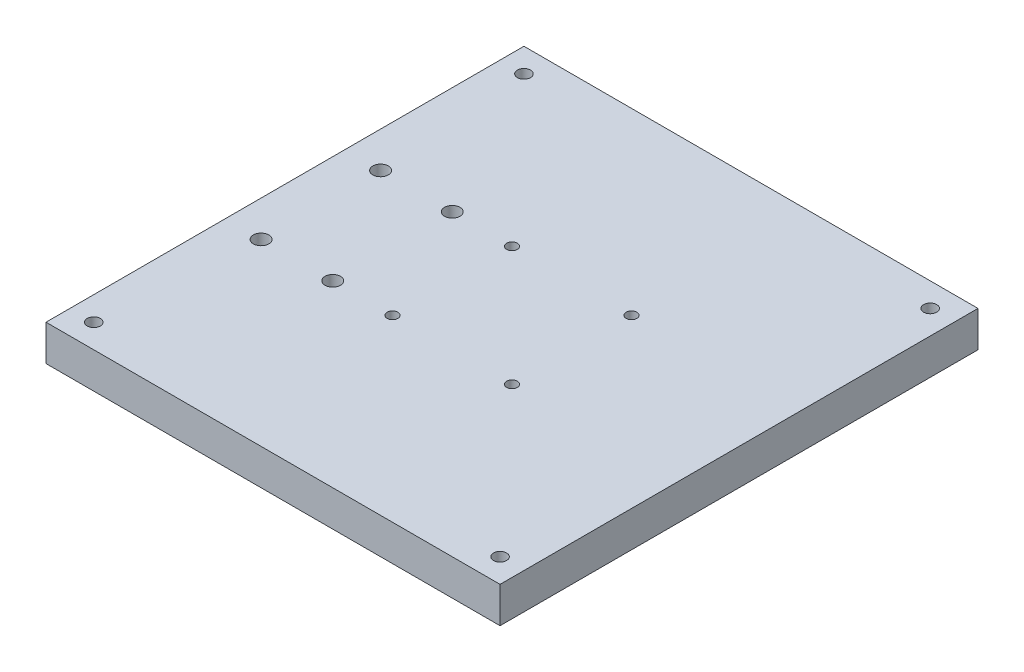
ISO-10303-21;
HEADER;
FILE_DESCRIPTION(('STEP AP214'),'2;1');
FILE_NAME('part.step','',(''),(''),'','','');
FILE_SCHEMA(('AUTOMOTIVE_DESIGN { 1 0 10303 214 1 1 1 1 }'));
ENDSEC;
DATA;
#1=APPLICATION_CONTEXT('core data for automotive mechanical design processes');
#2=APPLICATION_PROTOCOL_DEFINITION('international standard','automotive_design',2000,#1);
#3=PRODUCT_CONTEXT('',#1,'mechanical');
#4=PRODUCT('Part','Part','',(#3));
#5=PRODUCT_RELATED_PRODUCT_CATEGORY('part','',(#4));
#6=PRODUCT_DEFINITION_FORMATION('','',#4);
#7=PRODUCT_DEFINITION_CONTEXT('part definition',#1,'design');
#8=PRODUCT_DEFINITION('design','',#6,#7);
#9=PRODUCT_DEFINITION_SHAPE('','',#8);
#10=(LENGTH_UNIT() NAMED_UNIT(*) SI_UNIT(.MILLI.,.METRE.));
#11=(NAMED_UNIT(*) PLANE_ANGLE_UNIT() SI_UNIT($,.RADIAN.));
#12=(NAMED_UNIT(*) SI_UNIT($,.STERADIAN.) SOLID_ANGLE_UNIT());
#13=UNCERTAINTY_MEASURE_WITH_UNIT(LENGTH_MEASURE(1.E-05),#10,'distance_accuracy_value','');
#14=(GEOMETRIC_REPRESENTATION_CONTEXT(3) GLOBAL_UNCERTAINTY_ASSIGNED_CONTEXT((#13)) GLOBAL_UNIT_ASSIGNED_CONTEXT((#10,
#11,#12)) REPRESENTATION_CONTEXT('',''));
#15=CARTESIAN_POINT('',(0.,0.,0.));
#16=DIRECTION('',(0.,0.,1.));
#17=DIRECTION('',(1.,0.,0.));
#18=AXIS2_PLACEMENT_3D('',#15,#16,#17);
#19=CARTESIAN_POINT('',(0.,0.,0.));
#20=DIRECTION('',(0.,-1.,0.));
#21=DIRECTION('',(0.,0.,-1.));
#22=AXIS2_PLACEMENT_3D('',#19,#20,#21);
#23=PLANE('',#22);
#24=CARTESIAN_POINT('',(-99.2148760330578,0.,73.3471074380166));
#25=DIRECTION('',(0.,-1.,0.));
#26=DIRECTION('',(0.,0.,-1.));
#27=AXIS2_PLACEMENT_3D('',#24,#25,#26);
#28=CIRCLE('',#27,9.99999999999999);
#29=CARTESIAN_POINT('',(-99.2148760330578,0.,63.3471074380166));
#30=VERTEX_POINT('',#29);
#31=EDGE_CURVE('E542',#30,#30,#28,.T.);
#32=ORIENTED_EDGE('',*,*,#31,.F.);
#33=EDGE_LOOP('',(#32));
#34=FACE_BOUND('',#33,.T.);
#35=CARTESIAN_POINT('',(-159.214876033058,0.,73.3471074380166));
#36=DIRECTION('',(0.,-1.,0.));
#37=DIRECTION('',(0.,0.,-1.));
#38=AXIS2_PLACEMENT_3D('',#35,#36,#37);
#39=CIRCLE('',#38,9.99999999999998);
#40=CARTESIAN_POINT('',(-159.214876033058,0.,63.3471074380166));
#41=VERTEX_POINT('',#40);
#42=EDGE_CURVE('E179',#41,#41,#39,.T.);
#43=ORIENTED_EDGE('',*,*,#42,.F.);
#44=EDGE_LOOP('',(#43));
#45=FACE_BOUND('',#44,.T.);
#46=CARTESIAN_POINT('',(-159.214876033058,0.,-26.6528925619834));
#47=DIRECTION('',(0.,-1.,0.));
#48=DIRECTION('',(0.,0.,-1.));
#49=AXIS2_PLACEMENT_3D('',#46,#47,#48);
#50=CIRCLE('',#49,9.99999999999998);
#51=CARTESIAN_POINT('',(-159.214876033058,0.,-36.6528925619834));
#52=VERTEX_POINT('',#51);
#53=EDGE_CURVE('E175',#52,#52,#50,.T.);
#54=ORIENTED_EDGE('',*,*,#53,.F.);
#55=EDGE_LOOP('',(#54));
#56=FACE_BOUND('',#55,.T.);
#57=CARTESIAN_POINT('',(-99.2148760330578,0.,-26.6528925619834));
#58=DIRECTION('',(0.,-1.,0.));
#59=DIRECTION('',(0.,0.,-1.));
#60=AXIS2_PLACEMENT_3D('',#57,#58,#59);
#61=CIRCLE('',#60,9.99999999999999);
#62=CARTESIAN_POINT('',(-99.2148760330578,0.,-36.6528925619834));
#63=VERTEX_POINT('',#62);
#64=EDGE_CURVE('E167',#63,#63,#61,.T.);
#65=ORIENTED_EDGE('',*,*,#64,.F.);
#66=EDGE_LOOP('',(#65));
#67=FACE_BOUND('',#66,.T.);
#68=CARTESIAN_POINT('',(50.7851239669422,0.,-26.6528925619834));
#69=DIRECTION('',(0.,1.,0.));
#70=DIRECTION('',(0.,0.,1.));
#71=AXIS2_PLACEMENT_3D('',#68,#69,#70);
#72=CIRCLE('',#71,4.49999999999998);
#73=CARTESIAN_POINT('',(50.7851239669422,0.,-22.1528925619834));
#74=VERTEX_POINT('',#73);
#75=EDGE_CURVE('E210',#74,#74,#72,.T.);
#76=ORIENTED_EDGE('',*,*,#75,.T.);
#77=EDGE_LOOP('',(#76));
#78=FACE_BOUND('',#77,.T.);
#79=DIRECTION('',(0.,0.,-1.));
#80=VECTOR('',#79,1.);
#81=CARTESIAN_POINT('',(190.785123966942,0.,223.347107438017));
#82=LINE('',#81,#80);
#83=CARTESIAN_POINT('',(190.785123966942,0.,223.347107438017));
#84=VERTEX_POINT('',#83);
#85=CARTESIAN_POINT('',(190.785123966942,0.,-176.652892561983));
#86=VERTEX_POINT('',#85);
#87=EDGE_CURVE('E142',#84,#86,#82,.T.);
#88=ORIENTED_EDGE('',*,*,#87,.F.);
#89=DIRECTION('',(1.,0.,0.));
#90=VECTOR('',#89,1.);
#91=CARTESIAN_POINT('',(-189.214876033058,0.,223.347107438017));
#92=LINE('',#91,#90);
#93=CARTESIAN_POINT('',(-189.214876033058,0.,223.347107438017));
#94=VERTEX_POINT('',#93);
#95=EDGE_CURVE('E89',#94,#84,#92,.T.);
#96=ORIENTED_EDGE('',*,*,#95,.F.);
#97=DIRECTION('',(0.,0.,1.));
#98=VECTOR('',#97,1.);
#99=CARTESIAN_POINT('',(-189.214876033058,0.,223.347107438017));
#100=LINE('',#99,#98);
#101=CARTESIAN_POINT('',(-189.214876033058,0.,-176.652892561983));
#102=VERTEX_POINT('',#101);
#103=EDGE_CURVE('E85',#102,#94,#100,.T.);
#104=ORIENTED_EDGE('',*,*,#103,.F.);
#105=DIRECTION('',(-1.,0.,0.));
#106=VECTOR('',#105,1.);
#107=CARTESIAN_POINT('',(-189.214876033058,0.,-176.652892561983));
#108=LINE('',#107,#106);
#109=EDGE_CURVE('E153',#86,#102,#108,.T.);
#110=ORIENTED_EDGE('',*,*,#109,.F.);
#111=EDGE_LOOP('',(#88,#96,#104,#110));
#112=FACE_BOUND('',#111,.T.);
#113=CARTESIAN_POINT('',(155.785123966942,0.,188.347107438017));
#114=DIRECTION('',(0.,-1.,0.));
#115=DIRECTION('',(0.,0.,-1.));
#116=AXIS2_PLACEMENT_3D('',#113,#114,#115);
#117=CIRCLE('',#116,3.5);
#118=CARTESIAN_POINT('',(155.785123966942,0.,184.847107438017));
#119=VERTEX_POINT('',#118);
#120=EDGE_CURVE('E140',#119,#119,#117,.T.);
#121=ORIENTED_EDGE('',*,*,#120,.F.);
#122=EDGE_LOOP('',(#121));
#123=FACE_BOUND('',#122,.T.);
#124=CARTESIAN_POINT('',(-154.214876033058,0.,188.347107438017));
#125=DIRECTION('',(0.,-1.,0.));
#126=DIRECTION('',(0.,0.,-1.));
#127=AXIS2_PLACEMENT_3D('',#124,#125,#126);
#128=CIRCLE('',#127,3.5);
#129=CARTESIAN_POINT('',(-154.214876033058,0.,184.847107438017));
#130=VERTEX_POINT('',#129);
#131=EDGE_CURVE('E132',#130,#130,#128,.T.);
#132=ORIENTED_EDGE('',*,*,#131,.F.);
#133=EDGE_LOOP('',(#132));
#134=FACE_BOUND('',#133,.T.);
#135=CARTESIAN_POINT('',(155.785123966942,0.,-141.652892561983));
#136=DIRECTION('',(0.,-1.,0.));
#137=DIRECTION('',(0.,0.,-1.));
#138=AXIS2_PLACEMENT_3D('',#135,#136,#137);
#139=CIRCLE('',#138,3.5);
#140=CARTESIAN_POINT('',(155.785123966942,0.,-145.152892561983));
#141=VERTEX_POINT('',#140);
#142=EDGE_CURVE('E118',#141,#141,#139,.T.);
#143=ORIENTED_EDGE('',*,*,#142,.F.);
#144=EDGE_LOOP('',(#143));
#145=FACE_BOUND('',#144,.T.);
#146=CARTESIAN_POINT('',(-154.214876033058,0.,-141.652892561983));
#147=DIRECTION('',(0.,-1.,0.));
#148=DIRECTION('',(0.,0.,-1.));
#149=AXIS2_PLACEMENT_3D('',#146,#147,#148);
#150=CIRCLE('',#149,3.5);
#151=CARTESIAN_POINT('',(-154.214876033058,0.,-145.152892561983));
#152=VERTEX_POINT('',#151);
#153=EDGE_CURVE('E117',#152,#152,#150,.T.);
#154=ORIENTED_EDGE('',*,*,#153,.F.);
#155=EDGE_LOOP('',(#154));
#156=FACE_BOUND('',#155,.T.);
#157=CARTESIAN_POINT('',(170.785123966942,0.,203.347107438017));
#158=DIRECTION('',(0.,-1.,0.));
#159=DIRECTION('',(0.,0.,-1.));
#160=AXIS2_PLACEMENT_3D('',#157,#158,#159);
#161=CIRCLE('',#160,5.50000000000001);
#162=CARTESIAN_POINT('',(170.785123966942,0.,197.847107438017));
#163=VERTEX_POINT('',#162);
#164=EDGE_CURVE('E248',#163,#163,#161,.T.);
#165=ORIENTED_EDGE('',*,*,#164,.F.);
#166=EDGE_LOOP('',(#165));
#167=FACE_BOUND('',#166,.T.);
#168=CARTESIAN_POINT('',(-169.214876033058,0.,203.347107438017));
#169=DIRECTION('',(0.,-1.,0.));
#170=DIRECTION('',(0.,0.,-1.));
#171=AXIS2_PLACEMENT_3D('',#168,#169,#170);
#172=CIRCLE('',#171,5.50000000000001);
#173=CARTESIAN_POINT('',(-169.214876033058,0.,197.847107438017));
#174=VERTEX_POINT('',#173);
#175=EDGE_CURVE('E238',#174,#174,#172,.T.);
#176=ORIENTED_EDGE('',*,*,#175,.F.);
#177=EDGE_LOOP('',(#176));
#178=FACE_BOUND('',#177,.T.);
#179=CARTESIAN_POINT('',(170.785123966942,0.,-156.652892561983));
#180=DIRECTION('',(0.,-1.,0.));
#181=DIRECTION('',(0.,0.,-1.));
#182=AXIS2_PLACEMENT_3D('',#179,#180,#181);
#183=CIRCLE('',#182,5.50000000000001);
#184=CARTESIAN_POINT('',(170.785123966942,0.,-162.152892561983));
#185=VERTEX_POINT('',#184);
#186=EDGE_CURVE('E234',#185,#185,#183,.T.);
#187=ORIENTED_EDGE('',*,*,#186,.F.);
#188=EDGE_LOOP('',(#187));
#189=FACE_BOUND('',#188,.T.);
#190=CARTESIAN_POINT('',(-169.214876033058,0.,-156.652892561983));
#191=DIRECTION('',(0.,-1.,0.));
#192=DIRECTION('',(0.,0.,-1.));
#193=AXIS2_PLACEMENT_3D('',#190,#191,#192);
#194=CIRCLE('',#193,5.50000000000001);
#195=CARTESIAN_POINT('',(-169.214876033058,0.,-162.152892561983));
#196=VERTEX_POINT('',#195);
#197=EDGE_CURVE('E228',#196,#196,#194,.T.);
#198=ORIENTED_EDGE('',*,*,#197,.F.);
#199=EDGE_LOOP('',(#198));
#200=FACE_BOUND('',#199,.T.);
#201=CARTESIAN_POINT('',(-49.2148760330578,0.,-26.6528925619834));
#202=DIRECTION('',(0.,1.,0.));
#203=DIRECTION('',(0.,0.,1.));
#204=AXIS2_PLACEMENT_3D('',#201,#202,#203);
#205=CIRCLE('',#204,4.49999999999998);
#206=CARTESIAN_POINT('',(-49.2148760330578,0.,-22.1528925619834));
#207=VERTEX_POINT('',#206);
#208=EDGE_CURVE('E224',#207,#207,#205,.T.);
#209=ORIENTED_EDGE('',*,*,#208,.T.);
#210=EDGE_LOOP('',(#209));
#211=FACE_BOUND('',#210,.T.);
#212=CARTESIAN_POINT('',(50.7851239669422,0.,73.3471074380166));
#213=DIRECTION('',(0.,1.,0.));
#214=DIRECTION('',(0.,0.,1.));
#215=AXIS2_PLACEMENT_3D('',#212,#213,#214);
#216=CIRCLE('',#215,4.49999999999998);
#217=CARTESIAN_POINT('',(50.7851239669422,0.,77.8471074380166));
#218=VERTEX_POINT('',#217);
#219=EDGE_CURVE('E220',#218,#218,#216,.T.);
#220=ORIENTED_EDGE('',*,*,#219,.T.);
#221=EDGE_LOOP('',(#220));
#222=FACE_BOUND('',#221,.T.);
#223=CARTESIAN_POINT('',(-49.2148760330578,0.,73.3471074380166));
#224=DIRECTION('',(0.,1.,0.));
#225=DIRECTION('',(0.,0.,1.));
#226=AXIS2_PLACEMENT_3D('',#223,#224,#225);
#227=CIRCLE('',#226,4.49999999999998);
#228=CARTESIAN_POINT('',(-49.2148760330578,0.,77.8471074380166));
#229=VERTEX_POINT('',#228);
#230=EDGE_CURVE('E214',#229,#229,#227,.T.);
#231=ORIENTED_EDGE('',*,*,#230,.T.);
#232=EDGE_LOOP('',(#231));
#233=FACE_BOUND('',#232,.T.);
#234=ADVANCED_FACE('F44',(#34,#45,#56,#67,#78,#112,#123,#134,#145,#156,#167,#178,#189,#200,#211,
#222,#233),#23,.T.);
#235=CARTESIAN_POINT('',(190.785123966942,30.,223.347107438017));
#236=DIRECTION('',(-1.,0.,0.));
#237=DIRECTION('',(0.,0.,1.));
#238=AXIS2_PLACEMENT_3D('',#235,#236,#237);
#239=PLANE('',#238);
#240=ORIENTED_EDGE('',*,*,#87,.T.);
#241=DIRECTION('',(0.,-1.,0.));
#242=VECTOR('',#241,1.);
#243=CARTESIAN_POINT('',(190.785123966942,30.,-176.652892561983));
#244=LINE('',#243,#242);
#245=CARTESIAN_POINT('',(190.785123966942,30.,-176.652892561983));
#246=VERTEX_POINT('',#245);
#247=EDGE_CURVE('E11',#246,#86,#244,.T.);
#248=ORIENTED_EDGE('',*,*,#247,.F.);
#249=DIRECTION('',(0.,0.,-1.));
#250=VECTOR('',#249,1.);
#251=CARTESIAN_POINT('',(190.785123966942,30.,223.347107438017));
#252=LINE('',#251,#250);
#253=CARTESIAN_POINT('',(190.785123966942,30.,223.347107438017));
#254=VERTEX_POINT('',#253);
#255=EDGE_CURVE('E145',#254,#246,#252,.T.);
#256=ORIENTED_EDGE('',*,*,#255,.F.);
#257=DIRECTION('',(0.,-1.,0.));
#258=VECTOR('',#257,1.);
#259=CARTESIAN_POINT('',(190.785123966942,30.,223.347107438017));
#260=LINE('',#259,#258);
#261=EDGE_CURVE('E149',#254,#84,#260,.T.);
#262=ORIENTED_EDGE('',*,*,#261,.T.);
#263=EDGE_LOOP('',(#240,#248,#256,#262));
#264=FACE_BOUND('',#263,.T.);
#265=ADVANCED_FACE('F50',(#264),#239,.F.);
#266=CARTESIAN_POINT('',(-189.214876033058,30.,-176.652892561983));
#267=DIRECTION('',(0.,0.,1.));
#268=DIRECTION('',(1.,0.,0.));
#269=AXIS2_PLACEMENT_3D('',#266,#267,#268);
#270=PLANE('',#269);
#271=ORIENTED_EDGE('',*,*,#109,.T.);
#272=DIRECTION('',(0.,-1.,0.));
#273=VECTOR('',#272,1.);
#274=CARTESIAN_POINT('',(-189.214876033058,30.,-176.652892561983));
#275=LINE('',#274,#273);
#276=CARTESIAN_POINT('',(-189.214876033058,30.,-176.652892561983));
#277=VERTEX_POINT('',#276);
#278=EDGE_CURVE('E54',#277,#102,#275,.T.);
#279=ORIENTED_EDGE('',*,*,#278,.F.);
#280=DIRECTION('',(-1.,0.,0.));
#281=VECTOR('',#280,1.);
#282=CARTESIAN_POINT('',(-189.214876033058,30.,-176.652892561983));
#283=LINE('',#282,#281);
#284=EDGE_CURVE('E91',#246,#277,#283,.T.);
#285=ORIENTED_EDGE('',*,*,#284,.F.);
#286=ORIENTED_EDGE('',*,*,#247,.T.);
#287=EDGE_LOOP('',(#271,#279,#285,#286));
#288=FACE_BOUND('',#287,.T.);
#289=ADVANCED_FACE('F337',(#288),#270,.F.);
#290=CARTESIAN_POINT('',(-189.214876033058,30.,223.347107438017));
#291=DIRECTION('',(1.,0.,0.));
#292=DIRECTION('',(0.,0.,-1.));
#293=AXIS2_PLACEMENT_3D('',#290,#291,#292);
#294=PLANE('',#293);
#295=ORIENTED_EDGE('',*,*,#103,.T.);
#296=DIRECTION('',(0.,-1.,0.));
#297=VECTOR('',#296,1.);
#298=CARTESIAN_POINT('',(-189.214876033058,30.,223.347107438017));
#299=LINE('',#298,#297);
#300=CARTESIAN_POINT('',(-189.214876033058,30.,223.347107438017));
#301=VERTEX_POINT('',#300);
#302=EDGE_CURVE('E156',#301,#94,#299,.T.);
#303=ORIENTED_EDGE('',*,*,#302,.F.);
#304=DIRECTION('',(0.,0.,1.));
#305=VECTOR('',#304,1.);
#306=CARTESIAN_POINT('',(-189.214876033058,30.,223.347107438017));
#307=LINE('',#306,#305);
#308=EDGE_CURVE('E150',#277,#301,#307,.T.);
#309=ORIENTED_EDGE('',*,*,#308,.F.);
#310=ORIENTED_EDGE('',*,*,#278,.T.);
#311=EDGE_LOOP('',(#295,#303,#309,#310));
#312=FACE_BOUND('',#311,.T.);
#313=ADVANCED_FACE('F336',(#312),#294,.F.);
#314=CARTESIAN_POINT('',(-189.214876033058,30.,223.347107438017));
#315=DIRECTION('',(0.,0.,-1.));
#316=DIRECTION('',(-1.,0.,0.));
#317=AXIS2_PLACEMENT_3D('',#314,#315,#316);
#318=PLANE('',#317);
#319=ORIENTED_EDGE('',*,*,#95,.T.);
#320=ORIENTED_EDGE('',*,*,#261,.F.);
#321=DIRECTION('',(1.,0.,0.));
#322=VECTOR('',#321,1.);
#323=CARTESIAN_POINT('',(-189.214876033058,30.,223.347107438017));
#324=LINE('',#323,#322);
#325=EDGE_CURVE('E61',#301,#254,#324,.T.);
#326=ORIENTED_EDGE('',*,*,#325,.F.);
#327=ORIENTED_EDGE('',*,*,#302,.T.);
#328=EDGE_LOOP('',(#319,#320,#326,#327));
#329=FACE_BOUND('',#328,.T.);
#330=ADVANCED_FACE('F290',(#329),#318,.F.);
#331=CARTESIAN_POINT('',(0.,30.,0.));
#332=DIRECTION('',(0.,-1.,0.));
#333=DIRECTION('',(0.,0.,-1.));
#334=AXIS2_PLACEMENT_3D('',#331,#332,#333);
#335=PLANE('',#334);
#336=CARTESIAN_POINT('',(-159.214876033058,30.,-26.6528925619834));
#337=DIRECTION('',(0.,1.,0.));
#338=DIRECTION('',(0.,0.,1.));
#339=AXIS2_PLACEMENT_3D('',#336,#337,#338);
#340=CIRCLE('',#339,6.49999999999998);
#341=CARTESIAN_POINT('',(-159.214876033058,30.,-20.1528925619834));
#342=VERTEX_POINT('',#341);
#343=EDGE_CURVE('E161',#342,#342,#340,.T.);
#344=ORIENTED_EDGE('',*,*,#343,.F.);
#345=EDGE_LOOP('',(#344));
#346=FACE_BOUND('',#345,.T.);
#347=CARTESIAN_POINT('',(-99.2148760330578,30.,73.3471074380166));
#348=DIRECTION('',(0.,1.,0.));
#349=DIRECTION('',(0.,0.,1.));
#350=AXIS2_PLACEMENT_3D('',#347,#348,#349);
#351=CIRCLE('',#350,6.49999999999999);
#352=CARTESIAN_POINT('',(-99.2148760330578,30.,79.8471074380166));
#353=VERTEX_POINT('',#352);
#354=EDGE_CURVE('E194',#353,#353,#351,.T.);
#355=ORIENTED_EDGE('',*,*,#354,.F.);
#356=EDGE_LOOP('',(#355));
#357=FACE_BOUND('',#356,.T.);
#358=CARTESIAN_POINT('',(-159.214876033058,30.,73.3471074380166));
#359=DIRECTION('',(0.,1.,0.));
#360=DIRECTION('',(0.,0.,1.));
#361=AXIS2_PLACEMENT_3D('',#358,#359,#360);
#362=CIRCLE('',#361,6.49999999999998);
#363=CARTESIAN_POINT('',(-159.214876033058,30.,79.8471074380166));
#364=VERTEX_POINT('',#363);
#365=EDGE_CURVE('E198',#364,#364,#362,.T.);
#366=ORIENTED_EDGE('',*,*,#365,.F.);
#367=EDGE_LOOP('',(#366));
#368=FACE_BOUND('',#367,.T.);
#369=CARTESIAN_POINT('',(-99.2148760330578,30.,-26.6528925619834));
#370=DIRECTION('',(0.,1.,0.));
#371=DIRECTION('',(0.,0.,1.));
#372=AXIS2_PLACEMENT_3D('',#369,#370,#371);
#373=CIRCLE('',#372,6.49999999999999);
#374=CARTESIAN_POINT('',(-99.2148760330578,30.,-20.1528925619834));
#375=VERTEX_POINT('',#374);
#376=EDGE_CURVE('E201',#375,#375,#373,.T.);
#377=ORIENTED_EDGE('',*,*,#376,.F.);
#378=EDGE_LOOP('',(#377));
#379=FACE_BOUND('',#378,.T.);
#380=CARTESIAN_POINT('',(50.7851239669422,30.,-26.6528925619834));
#381=DIRECTION('',(0.,1.,0.));
#382=DIRECTION('',(0.,0.,1.));
#383=AXIS2_PLACEMENT_3D('',#380,#381,#382);
#384=CIRCLE('',#383,4.49999999999999);
#385=CARTESIAN_POINT('',(50.7851239669422,30.,-22.1528925619834));
#386=VERTEX_POINT('',#385);
#387=EDGE_CURVE('E203',#386,#386,#384,.T.);
#388=ORIENTED_EDGE('',*,*,#387,.F.);
#389=EDGE_LOOP('',(#388));
#390=FACE_BOUND('',#389,.T.);
#391=CARTESIAN_POINT('',(-49.2148760330578,30.,73.3471074380166));
#392=DIRECTION('',(0.,1.,0.));
#393=DIRECTION('',(0.,0.,1.));
#394=AXIS2_PLACEMENT_3D('',#391,#392,#393);
#395=CIRCLE('',#394,4.49999999999999);
#396=CARTESIAN_POINT('',(-49.2148760330578,30.,77.8471074380166));
#397=VERTEX_POINT('',#396);
#398=EDGE_CURVE('E208',#397,#397,#395,.T.);
#399=ORIENTED_EDGE('',*,*,#398,.F.);
#400=EDGE_LOOP('',(#399));
#401=FACE_BOUND('',#400,.T.);
#402=CARTESIAN_POINT('',(50.7851239669422,30.,73.3471074380166));
#403=DIRECTION('',(0.,1.,0.));
#404=DIRECTION('',(0.,0.,1.));
#405=AXIS2_PLACEMENT_3D('',#402,#403,#404);
#406=CIRCLE('',#405,4.49999999999999);
#407=CARTESIAN_POINT('',(50.7851239669422,30.,77.8471074380166));
#408=VERTEX_POINT('',#407);
#409=EDGE_CURVE('E218',#408,#408,#406,.T.);
#410=ORIENTED_EDGE('',*,*,#409,.F.);
#411=EDGE_LOOP('',(#410));
#412=FACE_BOUND('',#411,.T.);
#413=CARTESIAN_POINT('',(-49.2148760330578,30.,-26.6528925619834));
#414=DIRECTION('',(0.,1.,0.));
#415=DIRECTION('',(0.,0.,1.));
#416=AXIS2_PLACEMENT_3D('',#413,#414,#415);
#417=CIRCLE('',#416,4.49999999999999);
#418=CARTESIAN_POINT('',(-49.2148760330578,30.,-22.1528925619834));
#419=VERTEX_POINT('',#418);
#420=EDGE_CURVE('E225',#419,#419,#417,.T.);
#421=ORIENTED_EDGE('',*,*,#420,.F.);
#422=EDGE_LOOP('',(#421));
#423=FACE_BOUND('',#422,.T.);
#424=CARTESIAN_POINT('',(-169.214876033058,30.,-156.652892561983));
#425=DIRECTION('',(0.,-1.,0.));
#426=DIRECTION('',(0.,0.,-1.));
#427=AXIS2_PLACEMENT_3D('',#424,#425,#426);
#428=CIRCLE('',#427,5.50000000000001);
#429=CARTESIAN_POINT('',(-169.214876033058,30.,-162.152892561983));
#430=VERTEX_POINT('',#429);
#431=EDGE_CURVE('E232',#430,#430,#428,.T.);
#432=ORIENTED_EDGE('',*,*,#431,.T.);
#433=EDGE_LOOP('',(#432));
#434=FACE_BOUND('',#433,.T.);
#435=CARTESIAN_POINT('',(170.785123966942,30.,-156.652892561983));
#436=DIRECTION('',(0.,-1.,0.));
#437=DIRECTION('',(0.,0.,-1.));
#438=AXIS2_PLACEMENT_3D('',#435,#436,#437);
#439=CIRCLE('',#438,5.50000000000001);
#440=CARTESIAN_POINT('',(170.785123966942,30.,-162.152892561983));
#441=VERTEX_POINT('',#440);
#442=EDGE_CURVE('E240',#441,#441,#439,.T.);
#443=ORIENTED_EDGE('',*,*,#442,.T.);
#444=EDGE_LOOP('',(#443));
#445=FACE_BOUND('',#444,.T.);
#446=CARTESIAN_POINT('',(-169.214876033058,30.,203.347107438017));
#447=DIRECTION('',(0.,-1.,0.));
#448=DIRECTION('',(0.,0.,-1.));
#449=AXIS2_PLACEMENT_3D('',#446,#447,#448);
#450=CIRCLE('',#449,5.50000000000001);
#451=CARTESIAN_POINT('',(-169.214876033058,30.,197.847107438017));
#452=VERTEX_POINT('',#451);
#453=EDGE_CURVE('E242',#452,#452,#450,.T.);
#454=ORIENTED_EDGE('',*,*,#453,.T.);
#455=EDGE_LOOP('',(#454));
#456=FACE_BOUND('',#455,.T.);
#457=CARTESIAN_POINT('',(170.785123966942,30.,203.347107438017));
#458=DIRECTION('',(0.,-1.,0.));
#459=DIRECTION('',(0.,0.,-1.));
#460=AXIS2_PLACEMENT_3D('',#457,#458,#459);
#461=CIRCLE('',#460,5.50000000000001);
#462=CARTESIAN_POINT('',(170.785123966942,30.,197.847107438017));
#463=VERTEX_POINT('',#462);
#464=EDGE_CURVE('E124',#463,#463,#461,.T.);
#465=ORIENTED_EDGE('',*,*,#464,.T.);
#466=EDGE_LOOP('',(#465));
#467=FACE_BOUND('',#466,.T.);
#468=ORIENTED_EDGE('',*,*,#255,.T.);
#469=ORIENTED_EDGE('',*,*,#284,.T.);
#470=ORIENTED_EDGE('',*,*,#308,.T.);
#471=ORIENTED_EDGE('',*,*,#325,.T.);
#472=EDGE_LOOP('',(#468,#469,#470,#471));
#473=FACE_BOUND('',#472,.T.);
#474=ADVANCED_FACE('F252',(#346,#357,#368,#379,#390,#401,#412,#423,#434,#445,#456,#467,#473),
#335,.F.);
#475=CARTESIAN_POINT('',(155.785123966942,10.8969878334035,188.347107438017));
#476=DIRECTION('',(0.,-1.,0.));
#477=DIRECTION('',(0.,0.,-1.));
#478=AXIS2_PLACEMENT_3D('',#475,#476,#477);
#479=CONICAL_SURFACE('',#478,3.5,1.02974425867665);
#480=CARTESIAN_POINT('',(155.785123966942,13.,188.347107438017));
#481=VERTEX_POINT('',#480);
#482=VERTEX_LOOP('',#481);
#483=FACE_BOUND('',#482,.T.);
#484=CARTESIAN_POINT('',(155.785123966942,10.8969878334035,188.347107438017));
#485=DIRECTION('',(0.,-1.,0.));
#486=DIRECTION('',(0.,0.,-1.));
#487=AXIS2_PLACEMENT_3D('',#484,#485,#486);
#488=CIRCLE('',#487,3.5);
#489=CARTESIAN_POINT('',(155.785123966942,10.8969878334035,184.847107438017));
#490=VERTEX_POINT('',#489);
#491=EDGE_CURVE('E138',#490,#490,#488,.T.);
#492=ORIENTED_EDGE('',*,*,#491,.T.);
#493=EDGE_LOOP('',(#492));
#494=FACE_BOUND('',#493,.T.);
#495=ADVANCED_FACE('F287',(#483,#494),#479,.F.);
#496=CARTESIAN_POINT('',(155.785123966942,0.,188.347107438017));
#497=DIRECTION('',(0.,-1.,0.));
#498=DIRECTION('',(0.,0.,-1.));
#499=AXIS2_PLACEMENT_3D('',#496,#497,#498);
#500=CYLINDRICAL_SURFACE('',#499,3.5);
#501=ORIENTED_EDGE('',*,*,#491,.F.);
#502=EDGE_LOOP('',(#501));
#503=FACE_BOUND('',#502,.T.);
#504=ORIENTED_EDGE('',*,*,#120,.T.);
#505=EDGE_LOOP('',(#504));
#506=FACE_BOUND('',#505,.T.);
#507=ADVANCED_FACE('F328',(#503,#506),#500,.F.);
#508=CARTESIAN_POINT('',(-154.214876033058,10.8969878334035,188.347107438017));
#509=DIRECTION('',(0.,-1.,0.));
#510=DIRECTION('',(0.,0.,-1.));
#511=AXIS2_PLACEMENT_3D('',#508,#509,#510);
#512=CONICAL_SURFACE('',#511,3.5,1.02974425867665);
#513=CARTESIAN_POINT('',(-154.214876033058,13.,188.347107438017));
#514=VERTEX_POINT('',#513);
#515=VERTEX_LOOP('',#514);
#516=FACE_BOUND('',#515,.T.);
#517=CARTESIAN_POINT('',(-154.214876033058,10.8969878334035,188.347107438017));
#518=DIRECTION('',(0.,-1.,0.));
#519=DIRECTION('',(0.,0.,-1.));
#520=AXIS2_PLACEMENT_3D('',#517,#518,#519);
#521=CIRCLE('',#520,3.5);
#522=CARTESIAN_POINT('',(-154.214876033058,10.8969878334035,184.847107438017));
#523=VERTEX_POINT('',#522);
#524=EDGE_CURVE('E131',#523,#523,#521,.T.);
#525=ORIENTED_EDGE('',*,*,#524,.T.);
#526=EDGE_LOOP('',(#525));
#527=FACE_BOUND('',#526,.T.);
#528=ADVANCED_FACE('F322',(#516,#527),#512,.F.);
#529=CARTESIAN_POINT('',(-154.214876033058,0.,188.347107438017));
#530=DIRECTION('',(0.,-1.,0.));
#531=DIRECTION('',(0.,0.,-1.));
#532=AXIS2_PLACEMENT_3D('',#529,#530,#531);
#533=CYLINDRICAL_SURFACE('',#532,3.5);
#534=ORIENTED_EDGE('',*,*,#524,.F.);
#535=EDGE_LOOP('',(#534));
#536=FACE_BOUND('',#535,.T.);
#537=ORIENTED_EDGE('',*,*,#131,.T.);
#538=EDGE_LOOP('',(#537));
#539=FACE_BOUND('',#538,.T.);
#540=ADVANCED_FACE('F316',(#536,#539),#533,.F.);
#541=CARTESIAN_POINT('',(155.785123966942,10.8969878334035,-141.652892561983));
#542=DIRECTION('',(0.,-1.,0.));
#543=DIRECTION('',(0.,0.,-1.));
#544=AXIS2_PLACEMENT_3D('',#541,#542,#543);
#545=CONICAL_SURFACE('',#544,3.5,1.02974425867665);
#546=CARTESIAN_POINT('',(155.785123966942,13.,-141.652892561983));
#547=VERTEX_POINT('',#546);
#548=VERTEX_LOOP('',#547);
#549=FACE_BOUND('',#548,.T.);
#550=CARTESIAN_POINT('',(155.785123966942,10.8969878334035,-141.652892561983));
#551=DIRECTION('',(0.,-1.,0.));
#552=DIRECTION('',(0.,0.,-1.));
#553=AXIS2_PLACEMENT_3D('',#550,#551,#552);
#554=CIRCLE('',#553,3.5);
#555=CARTESIAN_POINT('',(155.785123966942,10.8969878334035,-145.152892561983));
#556=VERTEX_POINT('',#555);
#557=EDGE_CURVE('E125',#556,#556,#554,.T.);
#558=ORIENTED_EDGE('',*,*,#557,.T.);
#559=EDGE_LOOP('',(#558));
#560=FACE_BOUND('',#559,.T.);
#561=ADVANCED_FACE('F318',(#549,#560),#545,.F.);
#562=CARTESIAN_POINT('',(155.785123966942,0.,-141.652892561983));
#563=DIRECTION('',(0.,-1.,0.));
#564=DIRECTION('',(0.,0.,-1.));
#565=AXIS2_PLACEMENT_3D('',#562,#563,#564);
#566=CYLINDRICAL_SURFACE('',#565,3.5);
#567=ORIENTED_EDGE('',*,*,#557,.F.);
#568=EDGE_LOOP('',(#567));
#569=FACE_BOUND('',#568,.T.);
#570=ORIENTED_EDGE('',*,*,#142,.T.);
#571=EDGE_LOOP('',(#570));
#572=FACE_BOUND('',#571,.T.);
#573=ADVANCED_FACE('F115',(#569,#572),#566,.F.);
#574=CARTESIAN_POINT('',(-154.214876033058,10.8969878334035,-141.652892561983));
#575=DIRECTION('',(0.,-1.,0.));
#576=DIRECTION('',(0.,0.,-1.));
#577=AXIS2_PLACEMENT_3D('',#574,#575,#576);
#578=CONICAL_SURFACE('',#577,3.5,1.02974425867665);
#579=CARTESIAN_POINT('',(-154.214876033058,13.,-141.652892561983));
#580=VERTEX_POINT('',#579);
#581=VERTEX_LOOP('',#580);
#582=FACE_BOUND('',#581,.T.);
#583=CARTESIAN_POINT('',(-154.214876033058,10.8969878334035,-141.652892561983));
#584=DIRECTION('',(0.,-1.,0.));
#585=DIRECTION('',(0.,0.,-1.));
#586=AXIS2_PLACEMENT_3D('',#583,#584,#585);
#587=CIRCLE('',#586,3.5);
#588=CARTESIAN_POINT('',(-154.214876033058,10.8969878334035,-145.152892561983));
#589=VERTEX_POINT('',#588);
#590=EDGE_CURVE('E116',#589,#589,#587,.T.);
#591=ORIENTED_EDGE('',*,*,#590,.T.);
#592=EDGE_LOOP('',(#591));
#593=FACE_BOUND('',#592,.T.);
#594=ADVANCED_FACE('F106',(#582,#593),#578,.F.);
#595=CARTESIAN_POINT('',(-154.214876033058,0.,-141.652892561983));
#596=DIRECTION('',(0.,-1.,0.));
#597=DIRECTION('',(0.,0.,-1.));
#598=AXIS2_PLACEMENT_3D('',#595,#596,#597);
#599=CYLINDRICAL_SURFACE('',#598,3.5);
#600=ORIENTED_EDGE('',*,*,#590,.F.);
#601=EDGE_LOOP('',(#600));
#602=FACE_BOUND('',#601,.T.);
#603=ORIENTED_EDGE('',*,*,#153,.T.);
#604=EDGE_LOOP('',(#603));
#605=FACE_BOUND('',#604,.T.);
#606=ADVANCED_FACE('F113',(#602,#605),#599,.F.);
#607=CARTESIAN_POINT('',(170.785123966942,0.,203.347107438017));
#608=DIRECTION('',(0.,-1.,0.));
#609=DIRECTION('',(0.,0.,-1.));
#610=AXIS2_PLACEMENT_3D('',#607,#608,#609);
#611=CYLINDRICAL_SURFACE('',#610,5.50000000000001);
#612=ORIENTED_EDGE('',*,*,#464,.F.);
#613=EDGE_LOOP('',(#612));
#614=FACE_BOUND('',#613,.T.);
#615=ORIENTED_EDGE('',*,*,#164,.T.);
#616=EDGE_LOOP('',(#615));
#617=FACE_BOUND('',#616,.T.);
#618=ADVANCED_FACE('F253',(#614,#617),#611,.F.);
#619=CARTESIAN_POINT('',(-169.214876033058,0.,203.347107438017));
#620=DIRECTION('',(0.,-1.,0.));
#621=DIRECTION('',(0.,0.,-1.));
#622=AXIS2_PLACEMENT_3D('',#619,#620,#621);
#623=CYLINDRICAL_SURFACE('',#622,5.50000000000001);
#624=ORIENTED_EDGE('',*,*,#453,.F.);
#625=EDGE_LOOP('',(#624));
#626=FACE_BOUND('',#625,.T.);
#627=ORIENTED_EDGE('',*,*,#175,.T.);
#628=EDGE_LOOP('',(#627));
#629=FACE_BOUND('',#628,.T.);
#630=ADVANCED_FACE('F258',(#626,#629),#623,.F.);
#631=CARTESIAN_POINT('',(170.785123966942,0.,-156.652892561983));
#632=DIRECTION('',(0.,-1.,0.));
#633=DIRECTION('',(0.,0.,-1.));
#634=AXIS2_PLACEMENT_3D('',#631,#632,#633);
#635=CYLINDRICAL_SURFACE('',#634,5.50000000000001);
#636=ORIENTED_EDGE('',*,*,#442,.F.);
#637=EDGE_LOOP('',(#636));
#638=FACE_BOUND('',#637,.T.);
#639=ORIENTED_EDGE('',*,*,#186,.T.);
#640=EDGE_LOOP('',(#639));
#641=FACE_BOUND('',#640,.T.);
#642=ADVANCED_FACE('F305',(#638,#641),#635,.F.);
#643=CARTESIAN_POINT('',(-169.214876033058,0.,-156.652892561983));
#644=DIRECTION('',(0.,-1.,0.));
#645=DIRECTION('',(0.,0.,-1.));
#646=AXIS2_PLACEMENT_3D('',#643,#644,#645);
#647=CYLINDRICAL_SURFACE('',#646,5.50000000000001);
#648=ORIENTED_EDGE('',*,*,#431,.F.);
#649=EDGE_LOOP('',(#648));
#650=FACE_BOUND('',#649,.T.);
#651=ORIENTED_EDGE('',*,*,#197,.T.);
#652=EDGE_LOOP('',(#651));
#653=FACE_BOUND('',#652,.T.);
#654=ADVANCED_FACE('F310',(#650,#653),#647,.F.);
#655=CARTESIAN_POINT('',(-49.2148760330578,30.,-26.6528925619834));
#656=DIRECTION('',(0.,1.,0.));
#657=DIRECTION('',(0.,0.,1.));
#658=AXIS2_PLACEMENT_3D('',#655,#656,#657);
#659=CYLINDRICAL_SURFACE('',#658,4.49999999999999);
#660=ORIENTED_EDGE('',*,*,#208,.F.);
#661=EDGE_LOOP('',(#660));
#662=FACE_BOUND('',#661,.T.);
#663=ORIENTED_EDGE('',*,*,#420,.T.);
#664=EDGE_LOOP('',(#663));
#665=FACE_BOUND('',#664,.T.);
#666=ADVANCED_FACE('F375',(#662,#665),#659,.F.);
#667=CARTESIAN_POINT('',(50.7851239669422,30.,73.3471074380166));
#668=DIRECTION('',(0.,1.,0.));
#669=DIRECTION('',(0.,0.,1.));
#670=AXIS2_PLACEMENT_3D('',#667,#668,#669);
#671=CYLINDRICAL_SURFACE('',#670,4.49999999999999);
#672=ORIENTED_EDGE('',*,*,#219,.F.);
#673=EDGE_LOOP('',(#672));
#674=FACE_BOUND('',#673,.T.);
#675=ORIENTED_EDGE('',*,*,#409,.T.);
#676=EDGE_LOOP('',(#675));
#677=FACE_BOUND('',#676,.T.);
#678=ADVANCED_FACE('F279',(#674,#677),#671,.F.);
#679=CARTESIAN_POINT('',(-49.2148760330578,30.,73.3471074380166));
#680=DIRECTION('',(0.,1.,0.));
#681=DIRECTION('',(0.,0.,1.));
#682=AXIS2_PLACEMENT_3D('',#679,#680,#681);
#683=CYLINDRICAL_SURFACE('',#682,4.49999999999999);
#684=ORIENTED_EDGE('',*,*,#230,.F.);
#685=EDGE_LOOP('',(#684));
#686=FACE_BOUND('',#685,.T.);
#687=ORIENTED_EDGE('',*,*,#398,.T.);
#688=EDGE_LOOP('',(#687));
#689=FACE_BOUND('',#688,.T.);
#690=ADVANCED_FACE('F276',(#686,#689),#683,.F.);
#691=CARTESIAN_POINT('',(50.7851239669422,30.,-26.6528925619834));
#692=DIRECTION('',(0.,1.,0.));
#693=DIRECTION('',(0.,0.,1.));
#694=AXIS2_PLACEMENT_3D('',#691,#692,#693);
#695=CYLINDRICAL_SURFACE('',#694,4.49999999999999);
#696=ORIENTED_EDGE('',*,*,#75,.F.);
#697=EDGE_LOOP('',(#696));
#698=FACE_BOUND('',#697,.T.);
#699=ORIENTED_EDGE('',*,*,#387,.T.);
#700=EDGE_LOOP('',(#699));
#701=FACE_BOUND('',#700,.T.);
#702=ADVANCED_FACE('F278',(#698,#701),#695,.F.);
#703=CARTESIAN_POINT('',(-99.2148760330578,30.,-26.6528925619834));
#704=DIRECTION('',(0.,1.,0.));
#705=DIRECTION('',(0.,0.,1.));
#706=AXIS2_PLACEMENT_3D('',#703,#704,#705);
#707=CYLINDRICAL_SURFACE('',#706,6.49999999999998);
#708=CARTESIAN_POINT('',(-99.2148760330578,12.1030121665965,-26.6528925619834));
#709=DIRECTION('',(0.,-1.,0.));
#710=DIRECTION('',(0.,0.,-1.));
#711=AXIS2_PLACEMENT_3D('',#708,#709,#710);
#712=CIRCLE('',#711,6.49999999999998);
#713=CARTESIAN_POINT('',(-99.2148760330578,12.1030121665965,-33.1528925619834));
#714=VERTEX_POINT('',#713);
#715=EDGE_CURVE('E162',#714,#714,#712,.T.);
#716=ORIENTED_EDGE('',*,*,#715,.T.);
#717=EDGE_LOOP('',(#716));
#718=FACE_BOUND('',#717,.T.);
#719=ORIENTED_EDGE('',*,*,#376,.T.);
#720=EDGE_LOOP('',(#719));
#721=FACE_BOUND('',#720,.T.);
#722=ADVANCED_FACE('F400',(#718,#721),#707,.F.);
#723=CARTESIAN_POINT('',(-159.214876033058,30.,73.3471074380166));
#724=DIRECTION('',(0.,1.,0.));
#725=DIRECTION('',(0.,0.,1.));
#726=AXIS2_PLACEMENT_3D('',#723,#724,#725);
#727=CYLINDRICAL_SURFACE('',#726,6.49999999999998);
#728=CARTESIAN_POINT('',(-159.214876033058,12.1030121665965,73.3471074380166));
#729=DIRECTION('',(0.,-1.,0.));
#730=DIRECTION('',(0.,0.,-1.));
#731=AXIS2_PLACEMENT_3D('',#728,#729,#730);
#732=CIRCLE('',#731,6.49999999999998);
#733=CARTESIAN_POINT('',(-159.214876033058,12.1030121665965,66.8471074380166));
#734=VERTEX_POINT('',#733);
#735=EDGE_CURVE('E166',#734,#734,#732,.T.);
#736=ORIENTED_EDGE('',*,*,#735,.T.);
#737=EDGE_LOOP('',(#736));
#738=FACE_BOUND('',#737,.T.);
#739=ORIENTED_EDGE('',*,*,#365,.T.);
#740=EDGE_LOOP('',(#739));
#741=FACE_BOUND('',#740,.T.);
#742=ADVANCED_FACE('F418',(#738,#741),#727,.F.);
#743=CARTESIAN_POINT('',(-99.2148760330578,30.,73.3471074380166));
#744=DIRECTION('',(0.,1.,0.));
#745=DIRECTION('',(0.,0.,1.));
#746=AXIS2_PLACEMENT_3D('',#743,#744,#745);
#747=CYLINDRICAL_SURFACE('',#746,6.49999999999999);
#748=CARTESIAN_POINT('',(-99.2148760330578,12.1030121665965,73.3471074380166));
#749=DIRECTION('',(0.,-1.,0.));
#750=DIRECTION('',(0.,0.,-1.));
#751=AXIS2_PLACEMENT_3D('',#748,#749,#750);
#752=CIRCLE('',#751,6.49999999999999);
#753=CARTESIAN_POINT('',(-99.2148760330578,12.1030121665965,66.8471074380166));
#754=VERTEX_POINT('',#753);
#755=EDGE_CURVE('E47',#754,#754,#752,.T.);
#756=ORIENTED_EDGE('',*,*,#755,.T.);
#757=EDGE_LOOP('',(#756));
#758=FACE_BOUND('',#757,.T.);
#759=ORIENTED_EDGE('',*,*,#354,.T.);
#760=EDGE_LOOP('',(#759));
#761=FACE_BOUND('',#760,.T.);
#762=ADVANCED_FACE('F430',(#758,#761),#747,.F.);
#763=CARTESIAN_POINT('',(-159.214876033058,30.,-26.6528925619834));
#764=DIRECTION('',(0.,1.,0.));
#765=DIRECTION('',(0.,0.,1.));
#766=AXIS2_PLACEMENT_3D('',#763,#764,#765);
#767=CYLINDRICAL_SURFACE('',#766,6.49999999999998);
#768=CARTESIAN_POINT('',(-159.214876033058,12.1030121665965,-26.6528925619834));
#769=DIRECTION('',(0.,-1.,0.));
#770=DIRECTION('',(0.,0.,-1.));
#771=AXIS2_PLACEMENT_3D('',#768,#769,#770);
#772=CIRCLE('',#771,6.49999999999998);
#773=CARTESIAN_POINT('',(-159.214876033058,12.1030121665965,-33.1528925619834));
#774=VERTEX_POINT('',#773);
#775=EDGE_CURVE('E168',#774,#774,#772,.T.);
#776=ORIENTED_EDGE('',*,*,#775,.T.);
#777=EDGE_LOOP('',(#776));
#778=FACE_BOUND('',#777,.T.);
#779=ORIENTED_EDGE('',*,*,#343,.T.);
#780=EDGE_LOOP('',(#779));
#781=FACE_BOUND('',#780,.T.);
#782=ADVANCED_FACE('F433',(#778,#781),#767,.F.);
#783=CARTESIAN_POINT('',(-99.2148760330578,10.,-26.6528925619834));
#784=DIRECTION('',(0.,-1.,0.));
#785=DIRECTION('',(0.,0.,-1.));
#786=AXIS2_PLACEMENT_3D('',#783,#784,#785);
#787=CONICAL_SURFACE('',#786,9.99999999999999,1.02974425867665);
#788=CARTESIAN_POINT('',(-99.2148760330578,10.,-26.6528925619834));
#789=DIRECTION('',(0.,-1.,0.));
#790=DIRECTION('',(0.,0.,-1.));
#791=AXIS2_PLACEMENT_3D('',#788,#789,#790);
#792=CIRCLE('',#791,9.99999999999999);
#793=CARTESIAN_POINT('',(-99.2148760330578,10.,-36.6528925619834));
#794=VERTEX_POINT('',#793);
#795=EDGE_CURVE('E163',#794,#794,#792,.T.);
#796=ORIENTED_EDGE('',*,*,#795,.T.);
#797=EDGE_LOOP('',(#796));
#798=FACE_BOUND('',#797,.T.);
#799=ORIENTED_EDGE('',*,*,#715,.F.);
#800=EDGE_LOOP('',(#799));
#801=FACE_BOUND('',#800,.T.);
#802=ADVANCED_FACE('F445',(#798,#801),#787,.F.);
#803=CARTESIAN_POINT('',(-99.2148760330578,0.,-26.6528925619834));
#804=DIRECTION('',(0.,-1.,0.));
#805=DIRECTION('',(0.,0.,-1.));
#806=AXIS2_PLACEMENT_3D('',#803,#804,#805);
#807=CYLINDRICAL_SURFACE('',#806,9.99999999999999);
#808=ORIENTED_EDGE('',*,*,#795,.F.);
#809=EDGE_LOOP('',(#808));
#810=FACE_BOUND('',#809,.T.);
#811=ORIENTED_EDGE('',*,*,#64,.T.);
#812=EDGE_LOOP('',(#811));
#813=FACE_BOUND('',#812,.T.);
#814=ADVANCED_FACE('F453',(#810,#813),#807,.F.);
#815=CARTESIAN_POINT('',(-159.214876033058,10.,-26.6528925619834));
#816=DIRECTION('',(0.,-1.,0.));
#817=DIRECTION('',(0.,0.,-1.));
#818=AXIS2_PLACEMENT_3D('',#815,#816,#817);
#819=CONICAL_SURFACE('',#818,10.,1.02974425867666);
#820=CARTESIAN_POINT('',(-159.214876033058,10.,-26.6528925619834));
#821=DIRECTION('',(0.,-1.,0.));
#822=DIRECTION('',(0.,0.,-1.));
#823=AXIS2_PLACEMENT_3D('',#820,#821,#822);
#824=CIRCLE('',#823,10.);
#825=CARTESIAN_POINT('',(-159.214876033058,10.,-36.6528925619834));
#826=VERTEX_POINT('',#825);
#827=EDGE_CURVE('E170',#826,#826,#824,.T.);
#828=ORIENTED_EDGE('',*,*,#827,.T.);
#829=EDGE_LOOP('',(#828));
#830=FACE_BOUND('',#829,.T.);
#831=ORIENTED_EDGE('',*,*,#775,.F.);
#832=EDGE_LOOP('',(#831));
#833=FACE_BOUND('',#832,.T.);
#834=ADVANCED_FACE('F465',(#830,#833),#819,.F.);
#835=CARTESIAN_POINT('',(-159.214876033058,0.,-26.6528925619834));
#836=DIRECTION('',(0.,-1.,0.));
#837=DIRECTION('',(0.,0.,-1.));
#838=AXIS2_PLACEMENT_3D('',#835,#836,#837);
#839=CYLINDRICAL_SURFACE('',#838,9.99999999999999);
#840=ORIENTED_EDGE('',*,*,#827,.F.);
#841=EDGE_LOOP('',(#840));
#842=FACE_BOUND('',#841,.T.);
#843=ORIENTED_EDGE('',*,*,#53,.T.);
#844=EDGE_LOOP('',(#843));
#845=FACE_BOUND('',#844,.T.);
#846=ADVANCED_FACE('F473',(#842,#845),#839,.F.);
#847=CARTESIAN_POINT('',(-159.214876033058,10.,73.3471074380166));
#848=DIRECTION('',(0.,-1.,0.));
#849=DIRECTION('',(0.,0.,-1.));
#850=AXIS2_PLACEMENT_3D('',#847,#848,#849);
#851=CONICAL_SURFACE('',#850,10.,1.02974425867666);
#852=CARTESIAN_POINT('',(-159.214876033058,10.,73.3471074380166));
#853=DIRECTION('',(0.,-1.,0.));
#854=DIRECTION('',(0.,0.,-1.));
#855=AXIS2_PLACEMENT_3D('',#852,#853,#854);
#856=CIRCLE('',#855,10.);
#857=CARTESIAN_POINT('',(-159.214876033058,10.,63.3471074380166));
#858=VERTEX_POINT('',#857);
#859=EDGE_CURVE('E171',#858,#858,#856,.T.);
#860=ORIENTED_EDGE('',*,*,#859,.T.);
#861=EDGE_LOOP('',(#860));
#862=FACE_BOUND('',#861,.T.);
#863=ORIENTED_EDGE('',*,*,#735,.F.);
#864=EDGE_LOOP('',(#863));
#865=FACE_BOUND('',#864,.T.);
#866=ADVANCED_FACE('F476',(#862,#865),#851,.F.);
#867=CARTESIAN_POINT('',(-159.214876033058,0.,73.3471074380166));
#868=DIRECTION('',(0.,-1.,0.));
#869=DIRECTION('',(0.,0.,-1.));
#870=AXIS2_PLACEMENT_3D('',#867,#868,#869);
#871=CYLINDRICAL_SURFACE('',#870,9.99999999999999);
#872=ORIENTED_EDGE('',*,*,#859,.F.);
#873=EDGE_LOOP('',(#872));
#874=FACE_BOUND('',#873,.T.);
#875=ORIENTED_EDGE('',*,*,#42,.T.);
#876=EDGE_LOOP('',(#875));
#877=FACE_BOUND('',#876,.T.);
#878=ADVANCED_FACE('F489',(#874,#877),#871,.F.);
#879=CARTESIAN_POINT('',(-99.2148760330578,10.,73.3471074380166));
#880=DIRECTION('',(0.,-1.,0.));
#881=DIRECTION('',(0.,0.,-1.));
#882=AXIS2_PLACEMENT_3D('',#879,#880,#881);
#883=CONICAL_SURFACE('',#882,9.99999999999999,1.02974425867665);
#884=CARTESIAN_POINT('',(-99.2148760330578,10.,73.3471074380166));
#885=DIRECTION('',(0.,-1.,0.));
#886=DIRECTION('',(0.,0.,-1.));
#887=AXIS2_PLACEMENT_3D('',#884,#885,#886);
#888=CIRCLE('',#887,9.99999999999999);
#889=CARTESIAN_POINT('',(-99.2148760330578,10.,63.3471074380166));
#890=VERTEX_POINT('',#889);
#891=EDGE_CURVE('E538',#890,#890,#888,.T.);
#892=ORIENTED_EDGE('',*,*,#891,.T.);
#893=EDGE_LOOP('',(#892));
#894=FACE_BOUND('',#893,.T.);
#895=ORIENTED_EDGE('',*,*,#755,.F.);
#896=EDGE_LOOP('',(#895));
#897=FACE_BOUND('',#896,.T.);
#898=ADVANCED_FACE('F500',(#894,#897),#883,.F.);
#899=CARTESIAN_POINT('',(-99.2148760330578,0.,73.3471074380166));
#900=DIRECTION('',(0.,-1.,0.));
#901=DIRECTION('',(0.,0.,-1.));
#902=AXIS2_PLACEMENT_3D('',#899,#900,#901);
#903=CYLINDRICAL_SURFACE('',#902,9.99999999999999);
#904=ORIENTED_EDGE('',*,*,#891,.F.);
#905=EDGE_LOOP('',(#904));
#906=FACE_BOUND('',#905,.T.);
#907=ORIENTED_EDGE('',*,*,#31,.T.);
#908=EDGE_LOOP('',(#907));
#909=FACE_BOUND('',#908,.T.);
#910=ADVANCED_FACE('F507',(#906,#909),#903,.F.);
#911=CLOSED_SHELL('',(#234,#265,#289,#313,#330,#474,#495,#507,#528,#540,#561,#573,#594,#606,
#618,#630,#642,#654,#666,#678,#690,#702,#722,#742,#762,#782,#802,#814,#834,#846,#866,#878,#898,#910));
#912=MANIFOLD_SOLID_BREP('B2',#911);
#913=ADVANCED_BREP_SHAPE_REPRESENTATION('',(#18,#912),#14);
#914=SHAPE_DEFINITION_REPRESENTATION(#9,#913);
ENDSEC;
END-ISO-10303-21;
